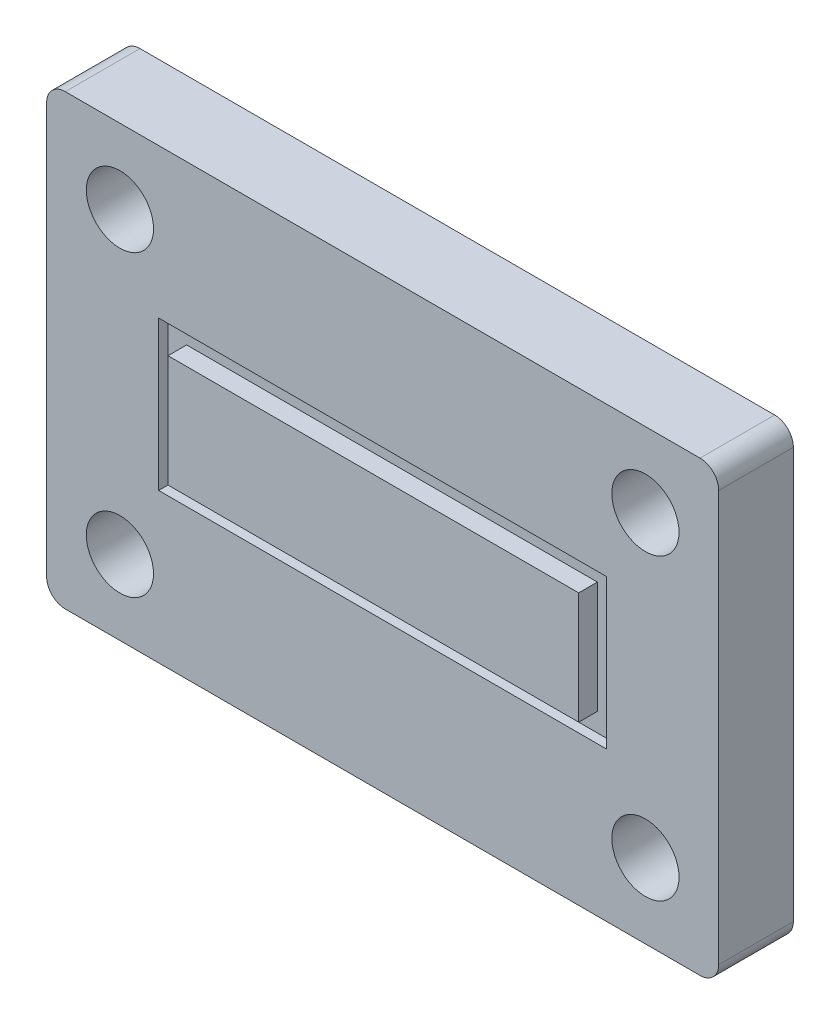
ISO-10303-21;
HEADER;
FILE_DESCRIPTION(('STEP AP214'),'2;1');
FILE_NAME('part.step','',(''),(''),'','','');
FILE_SCHEMA(('AUTOMOTIVE_DESIGN { 1 0 10303 214 1 1 1 1 }'));
ENDSEC;
DATA;
#1=APPLICATION_CONTEXT('core data for automotive mechanical design processes');
#2=APPLICATION_PROTOCOL_DEFINITION('international standard','automotive_design',2000,#1);
#3=PRODUCT_CONTEXT('',#1,'mechanical');
#4=PRODUCT('Part','Part','',(#3));
#5=PRODUCT_RELATED_PRODUCT_CATEGORY('part','',(#4));
#6=PRODUCT_DEFINITION_FORMATION('','',#4);
#7=PRODUCT_DEFINITION_CONTEXT('part definition',#1,'design');
#8=PRODUCT_DEFINITION('design','',#6,#7);
#9=PRODUCT_DEFINITION_SHAPE('','',#8);
#10=(LENGTH_UNIT() NAMED_UNIT(*) SI_UNIT(.MILLI.,.METRE.));
#11=(NAMED_UNIT(*) PLANE_ANGLE_UNIT() SI_UNIT($,.RADIAN.));
#12=(NAMED_UNIT(*) SI_UNIT($,.STERADIAN.) SOLID_ANGLE_UNIT());
#13=UNCERTAINTY_MEASURE_WITH_UNIT(LENGTH_MEASURE(1.E-05),#10,'distance_accuracy_value','');
#14=(GEOMETRIC_REPRESENTATION_CONTEXT(3) GLOBAL_UNCERTAINTY_ASSIGNED_CONTEXT((#13)) GLOBAL_UNIT_ASSIGNED_CONTEXT((#10,
#11,#12)) REPRESENTATION_CONTEXT('',''));
#15=CARTESIAN_POINT('',(0.,0.,0.));
#16=DIRECTION('',(0.,0.,1.));
#17=DIRECTION('',(1.,0.,0.));
#18=AXIS2_PLACEMENT_3D('',#15,#16,#17);
#19=CARTESIAN_POINT('',(29.,15.,4.5));
#20=DIRECTION('',(0.,-1.,0.));
#21=DIRECTION('',(0.,0.,-1.));
#22=AXIS2_PLACEMENT_3D('',#19,#20,#21);
#23=PLANE('',#22);
#24=DIRECTION('',(-1.,0.,0.));
#25=VECTOR('',#24,1.);
#26=CARTESIAN_POINT('',(29.,15.,3.5));
#27=LINE('',#26,#25);
#28=CARTESIAN_POINT('',(29.,15.,3.5));
#29=VERTEX_POINT('',#28);
#30=CARTESIAN_POINT('',(7.,15.,3.5));
#31=VERTEX_POINT('',#30);
#32=EDGE_CURVE('E106',#29,#31,#27,.T.);
#33=ORIENTED_EDGE('',*,*,#32,.T.);
#34=DIRECTION('',(0.,0.,-1.));
#35=VECTOR('',#34,1.);
#36=CARTESIAN_POINT('',(7.,15.,4.5));
#37=LINE('',#36,#35);
#38=CARTESIAN_POINT('',(7.,15.,4.5));
#39=VERTEX_POINT('',#38);
#40=EDGE_CURVE('E12',#39,#31,#37,.T.);
#41=ORIENTED_EDGE('',*,*,#40,.F.);
#42=DIRECTION('',(-1.,0.,0.));
#43=VECTOR('',#42,1.);
#44=CARTESIAN_POINT('',(29.,15.,4.5));
#45=LINE('',#44,#43);
#46=CARTESIAN_POINT('',(29.,15.,4.5));
#47=VERTEX_POINT('',#46);
#48=EDGE_CURVE('E94',#47,#39,#45,.T.);
#49=ORIENTED_EDGE('',*,*,#48,.F.);
#50=DIRECTION('',(0.,0.,-1.));
#51=VECTOR('',#50,1.);
#52=CARTESIAN_POINT('',(29.,15.,4.5));
#53=LINE('',#52,#51);
#54=EDGE_CURVE('E102',#47,#29,#53,.T.);
#55=ORIENTED_EDGE('',*,*,#54,.T.);
#56=EDGE_LOOP('',(#33,#41,#49,#55));
#57=FACE_BOUND('',#56,.T.);
#58=ADVANCED_FACE('F43',(#57),#23,.F.);
#59=CARTESIAN_POINT('',(7.,15.,4.5));
#60=DIRECTION('',(1.,0.,0.));
#61=DIRECTION('',(0.,0.,-1.));
#62=AXIS2_PLACEMENT_3D('',#59,#60,#61);
#63=PLANE('',#62);
#64=DIRECTION('',(0.,-1.,0.));
#65=VECTOR('',#64,1.);
#66=CARTESIAN_POINT('',(7.,15.,3.5));
#67=LINE('',#66,#65);
#68=CARTESIAN_POINT('',(7.,9.,3.5));
#69=VERTEX_POINT('',#68);
#70=EDGE_CURVE('E98',#31,#69,#67,.T.);
#71=ORIENTED_EDGE('',*,*,#70,.T.);
#72=DIRECTION('',(0.,0.,-1.));
#73=VECTOR('',#72,1.);
#74=CARTESIAN_POINT('',(7.,9.,4.5));
#75=LINE('',#74,#73);
#76=CARTESIAN_POINT('',(7.,9.,4.5));
#77=VERTEX_POINT('',#76);
#78=EDGE_CURVE('E51',#77,#69,#75,.T.);
#79=ORIENTED_EDGE('',*,*,#78,.F.);
#80=DIRECTION('',(0.,-1.,0.));
#81=VECTOR('',#80,1.);
#82=CARTESIAN_POINT('',(7.,15.,4.5));
#83=LINE('',#82,#81);
#84=EDGE_CURVE('E89',#39,#77,#83,.T.);
#85=ORIENTED_EDGE('',*,*,#84,.F.);
#86=ORIENTED_EDGE('',*,*,#40,.T.);
#87=EDGE_LOOP('',(#71,#79,#85,#86));
#88=FACE_BOUND('',#87,.T.);
#89=ADVANCED_FACE('F97',(#88),#63,.F.);
#90=CARTESIAN_POINT('',(7.,9.,4.5));
#91=DIRECTION('',(0.,1.,0.));
#92=DIRECTION('',(0.,0.,1.));
#93=AXIS2_PLACEMENT_3D('',#90,#91,#92);
#94=PLANE('',#93);
#95=DIRECTION('',(1.,0.,0.));
#96=VECTOR('',#95,1.);
#97=CARTESIAN_POINT('',(7.,9.,3.5));
#98=LINE('',#97,#96);
#99=CARTESIAN_POINT('',(29.,9.,3.5));
#100=VERTEX_POINT('',#99);
#101=EDGE_CURVE('E76',#69,#100,#98,.T.);
#102=ORIENTED_EDGE('',*,*,#101,.T.);
#103=DIRECTION('',(0.,0.,-1.));
#104=VECTOR('',#103,1.);
#105=CARTESIAN_POINT('',(29.,9.,4.5));
#106=LINE('',#105,#104);
#107=CARTESIAN_POINT('',(29.,9.,4.5));
#108=VERTEX_POINT('',#107);
#109=EDGE_CURVE('E99',#108,#100,#106,.T.);
#110=ORIENTED_EDGE('',*,*,#109,.F.);
#111=DIRECTION('',(1.,0.,0.));
#112=VECTOR('',#111,1.);
#113=CARTESIAN_POINT('',(7.,9.,4.5));
#114=LINE('',#113,#112);
#115=EDGE_CURVE('E92',#77,#108,#114,.T.);
#116=ORIENTED_EDGE('',*,*,#115,.F.);
#117=ORIENTED_EDGE('',*,*,#78,.T.);
#118=EDGE_LOOP('',(#102,#110,#116,#117));
#119=FACE_BOUND('',#118,.T.);
#120=ADVANCED_FACE('F100',(#119),#94,.F.);
#121=CARTESIAN_POINT('',(29.,9.,4.5));
#122=DIRECTION('',(-1.,0.,0.));
#123=DIRECTION('',(0.,0.,1.));
#124=AXIS2_PLACEMENT_3D('',#121,#122,#123);
#125=PLANE('',#124);
#126=DIRECTION('',(0.,1.,0.));
#127=VECTOR('',#126,1.);
#128=CARTESIAN_POINT('',(29.,9.,3.5));
#129=LINE('',#128,#127);
#130=EDGE_CURVE('E82',#100,#29,#129,.T.);
#131=ORIENTED_EDGE('',*,*,#130,.T.);
#132=ORIENTED_EDGE('',*,*,#54,.F.);
#133=DIRECTION('',(0.,1.,0.));
#134=VECTOR('',#133,1.);
#135=CARTESIAN_POINT('',(29.,9.,4.5));
#136=LINE('',#135,#134);
#137=EDGE_CURVE('E59',#108,#47,#136,.T.);
#138=ORIENTED_EDGE('',*,*,#137,.F.);
#139=ORIENTED_EDGE('',*,*,#109,.T.);
#140=EDGE_LOOP('',(#131,#132,#138,#139));
#141=FACE_BOUND('',#140,.T.);
#142=ADVANCED_FACE('F113',(#141),#125,.F.);
#143=CARTESIAN_POINT('',(0.,0.,4.5));
#144=DIRECTION('',(0.,0.,1.));
#145=DIRECTION('',(1.,0.,0.));
#146=AXIS2_PLACEMENT_3D('',#143,#144,#145);
#147=PLANE('',#146);
#148=ORIENTED_EDGE('',*,*,#48,.T.);
#149=ORIENTED_EDGE('',*,*,#84,.T.);
#150=ORIENTED_EDGE('',*,*,#115,.T.);
#151=ORIENTED_EDGE('',*,*,#137,.T.);
#152=EDGE_LOOP('',(#148,#149,#150,#151));
#153=FACE_BOUND('',#152,.T.);
#154=ADVANCED_FACE('F90',(#153),#147,.T.);
#155=CARTESIAN_POINT('',(0.,0.,3.5));
#156=DIRECTION('',(0.,0.,1.));
#157=DIRECTION('',(1.,0.,0.));
#158=AXIS2_PLACEMENT_3D('',#155,#156,#157);
#159=PLANE('',#158);
#160=ORIENTED_EDGE('',*,*,#32,.F.);
#161=ORIENTED_EDGE('',*,*,#130,.F.);
#162=ORIENTED_EDGE('',*,*,#101,.F.);
#163=ORIENTED_EDGE('',*,*,#70,.F.);
#164=EDGE_LOOP('',(#160,#161,#162,#163));
#165=FACE_BOUND('',#164,.T.);
#166=ADVANCED_FACE('F116',(#165),#159,.F.);
#167=CLOSED_SHELL('',(#58,#89,#120,#142,#154,#166));
#168=MANIFOLD_SOLID_BREP('B2',#167);
#169=CARTESIAN_POINT('',(0.,0.,4.));
#170=DIRECTION('',(1.,0.,0.));
#171=DIRECTION('',(0.,0.,-1.));
#172=AXIS2_PLACEMENT_3D('',#169,#170,#171);
#173=PLANE('',#172);
#174=DIRECTION('',(0.,-1.,0.));
#175=VECTOR('',#174,1.);
#176=CARTESIAN_POINT('',(0.,0.,0.));
#177=LINE('',#176,#175);
#178=CARTESIAN_POINT('',(0.,23.,0.));
#179=VERTEX_POINT('',#178);
#180=CARTESIAN_POINT('',(0.,1.,0.));
#181=VERTEX_POINT('',#180);
#182=EDGE_CURVE('E314',#179,#181,#177,.T.);
#183=ORIENTED_EDGE('',*,*,#182,.T.);
#184=DIRECTION('',(0.,0.,-1.));
#185=VECTOR('',#184,1.);
#186=CARTESIAN_POINT('',(0.,1.,4.));
#187=LINE('',#186,#185);
#188=CARTESIAN_POINT('',(0.,1.,4.));
#189=VERTEX_POINT('',#188);
#190=EDGE_CURVE('E41',#181,#189,#187,.F.);
#191=ORIENTED_EDGE('',*,*,#190,.T.);
#192=DIRECTION('',(0.,-1.,0.));
#193=VECTOR('',#192,1.);
#194=CARTESIAN_POINT('',(0.,0.,4.));
#195=LINE('',#194,#193);
#196=CARTESIAN_POINT('',(0.,23.,4.));
#197=VERTEX_POINT('',#196);
#198=EDGE_CURVE('E315',#197,#189,#195,.T.);
#199=ORIENTED_EDGE('',*,*,#198,.F.);
#200=DIRECTION('',(0.,0.,-1.));
#201=VECTOR('',#200,1.);
#202=CARTESIAN_POINT('',(0.,23.,4.));
#203=LINE('',#202,#201);
#204=EDGE_CURVE('E174',#197,#179,#203,.T.);
#205=ORIENTED_EDGE('',*,*,#204,.T.);
#206=EDGE_LOOP('',(#183,#191,#199,#205));
#207=FACE_BOUND('',#206,.T.);
#208=ADVANCED_FACE('F166',(#207),#173,.F.);
#209=CARTESIAN_POINT('',(0.,0.,4.));
#210=DIRECTION('',(0.,1.,0.));
#211=DIRECTION('',(0.,0.,1.));
#212=AXIS2_PLACEMENT_3D('',#209,#210,#211);
#213=PLANE('',#212);
#214=DIRECTION('',(1.,0.,0.));
#215=VECTOR('',#214,1.);
#216=CARTESIAN_POINT('',(0.,0.,0.));
#217=LINE('',#216,#215);
#218=CARTESIAN_POINT('',(1.,0.,0.));
#219=VERTEX_POINT('',#218);
#220=CARTESIAN_POINT('',(35.,0.,0.));
#221=VERTEX_POINT('',#220);
#222=EDGE_CURVE('E330',#219,#221,#217,.T.);
#223=ORIENTED_EDGE('',*,*,#222,.T.);
#224=DIRECTION('',(0.,0.,-1.));
#225=VECTOR('',#224,1.);
#226=CARTESIAN_POINT('',(35.,0.,4.));
#227=LINE('',#226,#225);
#228=CARTESIAN_POINT('',(35.,0.,4.));
#229=VERTEX_POINT('',#228);
#230=EDGE_CURVE('E189',#221,#229,#227,.F.);
#231=ORIENTED_EDGE('',*,*,#230,.T.);
#232=DIRECTION('',(1.,0.,0.));
#233=VECTOR('',#232,1.);
#234=CARTESIAN_POINT('',(0.,0.,4.));
#235=LINE('',#234,#233);
#236=CARTESIAN_POINT('',(1.,0.,4.));
#237=VERTEX_POINT('',#236);
#238=EDGE_CURVE('E318',#237,#229,#235,.T.);
#239=ORIENTED_EDGE('',*,*,#238,.F.);
#240=DIRECTION('',(0.,0.,-1.));
#241=VECTOR('',#240,1.);
#242=CARTESIAN_POINT('',(1.,0.,4.));
#243=LINE('',#242,#241);
#244=EDGE_CURVE('E366',#237,#219,#243,.T.);
#245=ORIENTED_EDGE('',*,*,#244,.T.);
#246=EDGE_LOOP('',(#223,#231,#239,#245));
#247=FACE_BOUND('',#246,.T.);
#248=ADVANCED_FACE('F385',(#247),#213,.F.);
#249=CARTESIAN_POINT('',(36.,0.,4.));
#250=DIRECTION('',(-1.,0.,0.));
#251=DIRECTION('',(0.,0.,1.));
#252=AXIS2_PLACEMENT_3D('',#249,#250,#251);
#253=PLANE('',#252);
#254=DIRECTION('',(0.,1.,0.));
#255=VECTOR('',#254,1.);
#256=CARTESIAN_POINT('',(36.,0.,0.));
#257=LINE('',#256,#255);
#258=CARTESIAN_POINT('',(36.,1.,0.));
#259=VERTEX_POINT('',#258);
#260=CARTESIAN_POINT('',(36.,23.,0.));
#261=VERTEX_POINT('',#260);
#262=EDGE_CURVE('E332',#259,#261,#257,.T.);
#263=ORIENTED_EDGE('',*,*,#262,.T.);
#264=DIRECTION('',(0.,0.,-1.));
#265=VECTOR('',#264,1.);
#266=CARTESIAN_POINT('',(36.,23.,4.));
#267=LINE('',#266,#265);
#268=CARTESIAN_POINT('',(36.,23.,4.));
#269=VERTEX_POINT('',#268);
#270=EDGE_CURVE('E356',#261,#269,#267,.F.);
#271=ORIENTED_EDGE('',*,*,#270,.T.);
#272=DIRECTION('',(0.,1.,0.));
#273=VECTOR('',#272,1.);
#274=CARTESIAN_POINT('',(36.,0.,4.));
#275=LINE('',#274,#273);
#276=CARTESIAN_POINT('',(36.,1.,4.));
#277=VERTEX_POINT('',#276);
#278=EDGE_CURVE('E321',#277,#269,#275,.T.);
#279=ORIENTED_EDGE('',*,*,#278,.F.);
#280=DIRECTION('',(0.,0.,-1.));
#281=VECTOR('',#280,1.);
#282=CARTESIAN_POINT('',(36.,1.,4.));
#283=LINE('',#282,#281);
#284=EDGE_CURVE('E353',#277,#259,#283,.T.);
#285=ORIENTED_EDGE('',*,*,#284,.T.);
#286=EDGE_LOOP('',(#263,#271,#279,#285));
#287=FACE_BOUND('',#286,.T.);
#288=ADVANCED_FACE('F395',(#287),#253,.F.);
#289=CARTESIAN_POINT('',(0.,24.,4.));
#290=DIRECTION('',(0.,-1.,0.));
#291=DIRECTION('',(0.,0.,-1.));
#292=AXIS2_PLACEMENT_3D('',#289,#290,#291);
#293=PLANE('',#292);
#294=DIRECTION('',(-1.,0.,0.));
#295=VECTOR('',#294,1.);
#296=CARTESIAN_POINT('',(0.,24.,4.));
#297=LINE('',#296,#295);
#298=CARTESIAN_POINT('',(35.,24.,4.));
#299=VERTEX_POINT('',#298);
#300=CARTESIAN_POINT('',(1.,24.,4.));
#301=VERTEX_POINT('',#300);
#302=EDGE_CURVE('E324',#299,#301,#297,.T.);
#303=ORIENTED_EDGE('',*,*,#302,.F.);
#304=DIRECTION('',(0.,0.,-1.));
#305=VECTOR('',#304,1.);
#306=CARTESIAN_POINT('',(35.,24.,4.));
#307=LINE('',#306,#305);
#308=CARTESIAN_POINT('',(35.,24.,0.));
#309=VERTEX_POINT('',#308);
#310=EDGE_CURVE('E342',#299,#309,#307,.T.);
#311=ORIENTED_EDGE('',*,*,#310,.T.);
#312=DIRECTION('',(-1.,0.,0.));
#313=VECTOR('',#312,1.);
#314=CARTESIAN_POINT('',(0.,24.,0.));
#315=LINE('',#314,#313);
#316=CARTESIAN_POINT('',(1.,24.,0.));
#317=VERTEX_POINT('',#316);
#318=EDGE_CURVE('E319',#309,#317,#315,.T.);
#319=ORIENTED_EDGE('',*,*,#318,.T.);
#320=DIRECTION('',(0.,0.,-1.));
#321=VECTOR('',#320,1.);
#322=CARTESIAN_POINT('',(1.,24.,4.));
#323=LINE('',#322,#321);
#324=EDGE_CURVE('E327',#317,#301,#323,.F.);
#325=ORIENTED_EDGE('',*,*,#324,.T.);
#326=EDGE_LOOP('',(#303,#311,#319,#325));
#327=FACE_BOUND('',#326,.T.);
#328=ADVANCED_FACE('F403',(#327),#293,.F.);
#329=CARTESIAN_POINT('',(0.,0.,4.));
#330=DIRECTION('',(0.,0.,-1.));
#331=DIRECTION('',(-1.,0.,0.));
#332=AXIS2_PLACEMENT_3D('',#329,#330,#331);
#333=PLANE('',#332);
#334=DIRECTION('',(1.,0.,0.));
#335=VECTOR('',#334,1.);
#336=CARTESIAN_POINT('',(6.,8.,4.));
#337=LINE('',#336,#335);
#338=CARTESIAN_POINT('',(6.,8.,4.));
#339=VERTEX_POINT('',#338);
#340=CARTESIAN_POINT('',(30.,8.,4.));
#341=VERTEX_POINT('',#340);
#342=EDGE_CURVE('E285',#339,#341,#337,.T.);
#343=ORIENTED_EDGE('',*,*,#342,.F.);
#344=DIRECTION('',(0.,-1.,0.));
#345=VECTOR('',#344,1.);
#346=CARTESIAN_POINT('',(6.,16.,4.));
#347=LINE('',#346,#345);
#348=CARTESIAN_POINT('',(6.,16.,4.));
#349=VERTEX_POINT('',#348);
#350=EDGE_CURVE('E181',#349,#339,#347,.T.);
#351=ORIENTED_EDGE('',*,*,#350,.F.);
#352=DIRECTION('',(-1.,0.,0.));
#353=VECTOR('',#352,1.);
#354=CARTESIAN_POINT('',(6.,16.,4.));
#355=LINE('',#354,#353);
#356=CARTESIAN_POINT('',(30.,16.,4.));
#357=VERTEX_POINT('',#356);
#358=EDGE_CURVE('E276',#357,#349,#355,.T.);
#359=ORIENTED_EDGE('',*,*,#358,.F.);
#360=DIRECTION('',(0.,1.,0.));
#361=VECTOR('',#360,1.);
#362=CARTESIAN_POINT('',(30.,16.,4.));
#363=LINE('',#362,#361);
#364=EDGE_CURVE('E279',#341,#357,#363,.T.);
#365=ORIENTED_EDGE('',*,*,#364,.F.);
#366=EDGE_LOOP('',(#343,#351,#359,#365));
#367=FACE_BOUND('',#366,.T.);
#368=CARTESIAN_POINT('',(3.92499999999992,20.,4.));
#369=DIRECTION('',(0.,0.,1.));
#370=DIRECTION('',(1.,0.,0.));
#371=AXIS2_PLACEMENT_3D('',#368,#369,#370);
#372=CIRCLE('',#371,1.8);
#373=CARTESIAN_POINT('',(5.72499999999992,20.,4.));
#374=VERTEX_POINT('',#373);
#375=EDGE_CURVE('E291',#374,#374,#372,.T.);
#376=ORIENTED_EDGE('',*,*,#375,.F.);
#377=EDGE_LOOP('',(#376));
#378=FACE_BOUND('',#377,.T.);
#379=CARTESIAN_POINT('',(32.0749999999999,20.,4.));
#380=DIRECTION('',(0.,0.,1.));
#381=DIRECTION('',(1.,0.,0.));
#382=AXIS2_PLACEMENT_3D('',#379,#380,#381);
#383=CIRCLE('',#382,1.8);
#384=CARTESIAN_POINT('',(33.8749999999999,20.,4.));
#385=VERTEX_POINT('',#384);
#386=EDGE_CURVE('E298',#385,#385,#383,.T.);
#387=ORIENTED_EDGE('',*,*,#386,.F.);
#388=EDGE_LOOP('',(#387));
#389=FACE_BOUND('',#388,.T.);
#390=CARTESIAN_POINT('',(32.0750000000001,4.,4.));
#391=DIRECTION('',(0.,0.,1.));
#392=DIRECTION('',(1.,0.,0.));
#393=AXIS2_PLACEMENT_3D('',#390,#391,#392);
#394=CIRCLE('',#393,1.8);
#395=CARTESIAN_POINT('',(33.8750000000001,4.,4.));
#396=VERTEX_POINT('',#395);
#397=EDGE_CURVE('E302',#396,#396,#394,.T.);
#398=ORIENTED_EDGE('',*,*,#397,.F.);
#399=EDGE_LOOP('',(#398));
#400=FACE_BOUND('',#399,.T.);
#401=CARTESIAN_POINT('',(3.92500000000008,4.,4.));
#402=DIRECTION('',(0.,0.,1.));
#403=DIRECTION('',(1.,0.,0.));
#404=AXIS2_PLACEMENT_3D('',#401,#402,#403);
#405=CIRCLE('',#404,1.8);
#406=CARTESIAN_POINT('',(5.72500000000008,4.,4.));
#407=VERTEX_POINT('',#406);
#408=EDGE_CURVE('E308',#407,#407,#405,.T.);
#409=ORIENTED_EDGE('',*,*,#408,.F.);
#410=EDGE_LOOP('',(#409));
#411=FACE_BOUND('',#410,.T.);
#412=ORIENTED_EDGE('',*,*,#278,.T.);
#413=CARTESIAN_POINT('',(35.,23.,4.));
#414=DIRECTION('',(0.,0.,-1.));
#415=DIRECTION('',(-1.,0.,0.));
#416=AXIS2_PLACEMENT_3D('',#413,#414,#415);
#417=CIRCLE('',#416,1.);
#418=EDGE_CURVE('E364',#269,#299,#417,.F.);
#419=ORIENTED_EDGE('',*,*,#418,.T.);
#420=ORIENTED_EDGE('',*,*,#302,.T.);
#421=CARTESIAN_POINT('',(1.,23.,4.));
#422=DIRECTION('',(0.,0.,-1.));
#423=DIRECTION('',(-1.,0.,0.));
#424=AXIS2_PLACEMENT_3D('',#421,#422,#423);
#425=CIRCLE('',#424,1.);
#426=EDGE_CURVE('E358',#301,#197,#425,.F.);
#427=ORIENTED_EDGE('',*,*,#426,.T.);
#428=ORIENTED_EDGE('',*,*,#198,.T.);
#429=CARTESIAN_POINT('',(1.,1.,4.));
#430=DIRECTION('',(0.,0.,-1.));
#431=DIRECTION('',(-1.,0.,0.));
#432=AXIS2_PLACEMENT_3D('',#429,#430,#431);
#433=CIRCLE('',#432,1.);
#434=EDGE_CURVE('E360',#189,#237,#433,.F.);
#435=ORIENTED_EDGE('',*,*,#434,.T.);
#436=ORIENTED_EDGE('',*,*,#238,.T.);
#437=CARTESIAN_POINT('',(35.,1.,4.));
#438=DIRECTION('',(0.,0.,-1.));
#439=DIRECTION('',(-1.,0.,0.));
#440=AXIS2_PLACEMENT_3D('',#437,#438,#439);
#441=CIRCLE('',#440,1.);
#442=EDGE_CURVE('E362',#229,#277,#441,.F.);
#443=ORIENTED_EDGE('',*,*,#442,.T.);
#444=EDGE_LOOP('',(#412,#419,#420,#427,#428,#435,#436,#443));
#445=FACE_BOUND('',#444,.T.);
#446=ADVANCED_FACE('F388',(#367,#378,#389,#400,#411,#445),#333,.F.);
#447=CARTESIAN_POINT('',(0.,0.,0.));
#448=DIRECTION('',(0.,0.,-1.));
#449=DIRECTION('',(-1.,0.,0.));
#450=AXIS2_PLACEMENT_3D('',#447,#448,#449);
#451=PLANE('',#450);
#452=CARTESIAN_POINT('',(3.92499999999992,20.,0.));
#453=DIRECTION('',(0.,0.,-1.));
#454=DIRECTION('',(-1.,0.,0.));
#455=AXIS2_PLACEMENT_3D('',#452,#453,#454);
#456=CIRCLE('',#455,1.8);
#457=CARTESIAN_POINT('',(2.12499999999992,20.,0.));
#458=VERTEX_POINT('',#457);
#459=EDGE_CURVE('E297',#458,#458,#456,.T.);
#460=ORIENTED_EDGE('',*,*,#459,.F.);
#461=EDGE_LOOP('',(#460));
#462=FACE_BOUND('',#461,.T.);
#463=CARTESIAN_POINT('',(32.0749999999999,20.,0.));
#464=DIRECTION('',(0.,0.,-1.));
#465=DIRECTION('',(-1.,0.,0.));
#466=AXIS2_PLACEMENT_3D('',#463,#464,#465);
#467=CIRCLE('',#466,1.8);
#468=CARTESIAN_POINT('',(30.2749999999999,20.,0.));
#469=VERTEX_POINT('',#468);
#470=EDGE_CURVE('E301',#469,#469,#467,.T.);
#471=ORIENTED_EDGE('',*,*,#470,.F.);
#472=EDGE_LOOP('',(#471));
#473=FACE_BOUND('',#472,.T.);
#474=CARTESIAN_POINT('',(32.0750000000001,4.,0.));
#475=DIRECTION('',(0.,0.,-1.));
#476=DIRECTION('',(-1.,0.,0.));
#477=AXIS2_PLACEMENT_3D('',#474,#475,#476);
#478=CIRCLE('',#477,1.8);
#479=CARTESIAN_POINT('',(30.2750000000001,4.,0.));
#480=VERTEX_POINT('',#479);
#481=EDGE_CURVE('E305',#480,#480,#478,.T.);
#482=ORIENTED_EDGE('',*,*,#481,.F.);
#483=EDGE_LOOP('',(#482));
#484=FACE_BOUND('',#483,.T.);
#485=CARTESIAN_POINT('',(3.92500000000008,4.,0.));
#486=DIRECTION('',(0.,0.,-1.));
#487=DIRECTION('',(-1.,0.,0.));
#488=AXIS2_PLACEMENT_3D('',#485,#486,#487);
#489=CIRCLE('',#488,1.8);
#490=CARTESIAN_POINT('',(2.12500000000009,4.,0.));
#491=VERTEX_POINT('',#490);
#492=EDGE_CURVE('E311',#491,#491,#489,.T.);
#493=ORIENTED_EDGE('',*,*,#492,.F.);
#494=EDGE_LOOP('',(#493));
#495=FACE_BOUND('',#494,.T.);
#496=ORIENTED_EDGE('',*,*,#318,.F.);
#497=CARTESIAN_POINT('',(35.,23.,0.));
#498=DIRECTION('',(0.,0.,-1.));
#499=DIRECTION('',(-1.,0.,0.));
#500=AXIS2_PLACEMENT_3D('',#497,#498,#499);
#501=CIRCLE('',#500,1.);
#502=EDGE_CURVE('E351',#309,#261,#501,.T.);
#503=ORIENTED_EDGE('',*,*,#502,.T.);
#504=ORIENTED_EDGE('',*,*,#262,.F.);
#505=CARTESIAN_POINT('',(35.,1.,0.));
#506=DIRECTION('',(0.,0.,-1.));
#507=DIRECTION('',(-1.,0.,0.));
#508=AXIS2_PLACEMENT_3D('',#505,#506,#507);
#509=CIRCLE('',#508,1.);
#510=EDGE_CURVE('E349',#259,#221,#509,.T.);
#511=ORIENTED_EDGE('',*,*,#510,.T.);
#512=ORIENTED_EDGE('',*,*,#222,.F.);
#513=CARTESIAN_POINT('',(1.,1.,0.));
#514=DIRECTION('',(0.,0.,-1.));
#515=DIRECTION('',(-1.,0.,0.));
#516=AXIS2_PLACEMENT_3D('',#513,#514,#515);
#517=CIRCLE('',#516,1.);
#518=EDGE_CURVE('E347',#219,#181,#517,.T.);
#519=ORIENTED_EDGE('',*,*,#518,.T.);
#520=ORIENTED_EDGE('',*,*,#182,.F.);
#521=CARTESIAN_POINT('',(1.,23.,0.));
#522=DIRECTION('',(0.,0.,-1.));
#523=DIRECTION('',(-1.,0.,0.));
#524=AXIS2_PLACEMENT_3D('',#521,#522,#523);
#525=CIRCLE('',#524,1.);
#526=EDGE_CURVE('E345',#179,#317,#525,.T.);
#527=ORIENTED_EDGE('',*,*,#526,.T.);
#528=EDGE_LOOP('',(#496,#503,#504,#511,#512,#519,#520,#527));
#529=FACE_BOUND('',#528,.T.);
#530=ADVANCED_FACE('F379',(#462,#473,#484,#495,#529),#451,.T.);
#531=CARTESIAN_POINT('',(3.92500000000008,4.,4.));
#532=DIRECTION('',(0.,0.,1.));
#533=DIRECTION('',(1.,0.,0.));
#534=AXIS2_PLACEMENT_3D('',#531,#532,#533);
#535=CYLINDRICAL_SURFACE('',#534,1.8);
#536=ORIENTED_EDGE('',*,*,#492,.T.);
#537=EDGE_LOOP('',(#536));
#538=FACE_BOUND('',#537,.T.);
#539=ORIENTED_EDGE('',*,*,#408,.T.);
#540=EDGE_LOOP('',(#539));
#541=FACE_BOUND('',#540,.T.);
#542=ADVANCED_FACE('F501',(#538,#541),#535,.F.);
#543=CARTESIAN_POINT('',(32.0750000000001,4.,4.));
#544=DIRECTION('',(0.,0.,1.));
#545=DIRECTION('',(1.,0.,0.));
#546=AXIS2_PLACEMENT_3D('',#543,#544,#545);
#547=CYLINDRICAL_SURFACE('',#546,1.8);
#548=ORIENTED_EDGE('',*,*,#481,.T.);
#549=EDGE_LOOP('',(#548));
#550=FACE_BOUND('',#549,.T.);
#551=ORIENTED_EDGE('',*,*,#397,.T.);
#552=EDGE_LOOP('',(#551));
#553=FACE_BOUND('',#552,.T.);
#554=ADVANCED_FACE('F497',(#550,#553),#547,.F.);
#555=CARTESIAN_POINT('',(32.0749999999999,20.,4.));
#556=DIRECTION('',(0.,0.,1.));
#557=DIRECTION('',(1.,0.,0.));
#558=AXIS2_PLACEMENT_3D('',#555,#556,#557);
#559=CYLINDRICAL_SURFACE('',#558,1.8);
#560=ORIENTED_EDGE('',*,*,#470,.T.);
#561=EDGE_LOOP('',(#560));
#562=FACE_BOUND('',#561,.T.);
#563=ORIENTED_EDGE('',*,*,#386,.T.);
#564=EDGE_LOOP('',(#563));
#565=FACE_BOUND('',#564,.T.);
#566=ADVANCED_FACE('F493',(#562,#565),#559,.F.);
#567=CARTESIAN_POINT('',(3.92499999999992,20.,4.));
#568=DIRECTION('',(0.,0.,1.));
#569=DIRECTION('',(1.,0.,0.));
#570=AXIS2_PLACEMENT_3D('',#567,#568,#569);
#571=CYLINDRICAL_SURFACE('',#570,1.8);
#572=ORIENTED_EDGE('',*,*,#459,.T.);
#573=EDGE_LOOP('',(#572));
#574=FACE_BOUND('',#573,.T.);
#575=ORIENTED_EDGE('',*,*,#375,.T.);
#576=EDGE_LOOP('',(#575));
#577=FACE_BOUND('',#576,.T.);
#578=ADVANCED_FACE('F422',(#574,#577),#571,.F.);
#579=CARTESIAN_POINT('',(35.,23.,4.));
#580=DIRECTION('',(0.,0.,-1.));
#581=DIRECTION('',(-1.,0.,0.));
#582=AXIS2_PLACEMENT_3D('',#579,#580,#581);
#583=CYLINDRICAL_SURFACE('',#582,1.);
#584=ORIENTED_EDGE('',*,*,#418,.F.);
#585=ORIENTED_EDGE('',*,*,#270,.F.);
#586=ORIENTED_EDGE('',*,*,#502,.F.);
#587=ORIENTED_EDGE('',*,*,#310,.F.);
#588=EDGE_LOOP('',(#584,#585,#586,#587));
#589=FACE_BOUND('',#588,.T.);
#590=ADVANCED_FACE('F400',(#589),#583,.T.);
#591=CARTESIAN_POINT('',(35.,1.,4.));
#592=DIRECTION('',(0.,0.,-1.));
#593=DIRECTION('',(-1.,0.,0.));
#594=AXIS2_PLACEMENT_3D('',#591,#592,#593);
#595=CYLINDRICAL_SURFACE('',#594,1.);
#596=ORIENTED_EDGE('',*,*,#442,.F.);
#597=ORIENTED_EDGE('',*,*,#230,.F.);
#598=ORIENTED_EDGE('',*,*,#510,.F.);
#599=ORIENTED_EDGE('',*,*,#284,.F.);
#600=EDGE_LOOP('',(#596,#597,#598,#599));
#601=FACE_BOUND('',#600,.T.);
#602=ADVANCED_FACE('F392',(#601),#595,.T.);
#603=CARTESIAN_POINT('',(1.,1.,4.));
#604=DIRECTION('',(0.,0.,-1.));
#605=DIRECTION('',(-1.,0.,0.));
#606=AXIS2_PLACEMENT_3D('',#603,#604,#605);
#607=CYLINDRICAL_SURFACE('',#606,1.);
#608=ORIENTED_EDGE('',*,*,#434,.F.);
#609=ORIENTED_EDGE('',*,*,#190,.F.);
#610=ORIENTED_EDGE('',*,*,#518,.F.);
#611=ORIENTED_EDGE('',*,*,#244,.F.);
#612=EDGE_LOOP('',(#608,#609,#610,#611));
#613=FACE_BOUND('',#612,.T.);
#614=ADVANCED_FACE('F384',(#613),#607,.T.);
#615=CARTESIAN_POINT('',(1.,23.,4.));
#616=DIRECTION('',(0.,0.,-1.));
#617=DIRECTION('',(-1.,0.,0.));
#618=AXIS2_PLACEMENT_3D('',#615,#616,#617);
#619=CYLINDRICAL_SURFACE('',#618,1.);
#620=ORIENTED_EDGE('',*,*,#426,.F.);
#621=ORIENTED_EDGE('',*,*,#324,.F.);
#622=ORIENTED_EDGE('',*,*,#526,.F.);
#623=ORIENTED_EDGE('',*,*,#204,.F.);
#624=EDGE_LOOP('',(#620,#621,#622,#623));
#625=FACE_BOUND('',#624,.T.);
#626=ADVANCED_FACE('F168',(#625),#619,.T.);
#627=CARTESIAN_POINT('',(6.,16.,3.5));
#628=DIRECTION('',(-1.,0.,0.));
#629=DIRECTION('',(0.,0.,1.));
#630=AXIS2_PLACEMENT_3D('',#627,#628,#629);
#631=PLANE('',#630);
#632=ORIENTED_EDGE('',*,*,#350,.T.);
#633=DIRECTION('',(0.,0.,1.));
#634=VECTOR('',#633,1.);
#635=CARTESIAN_POINT('',(6.,8.,3.5));
#636=LINE('',#635,#634);
#637=CARTESIAN_POINT('',(6.,8.,3.5));
#638=VERTEX_POINT('',#637);
#639=EDGE_CURVE('E254',#638,#339,#636,.T.);
#640=ORIENTED_EDGE('',*,*,#639,.F.);
#641=DIRECTION('',(0.,-1.,0.));
#642=VECTOR('',#641,1.);
#643=CARTESIAN_POINT('',(6.,16.,3.5));
#644=LINE('',#643,#642);
#645=CARTESIAN_POINT('',(6.,16.,3.5));
#646=VERTEX_POINT('',#645);
#647=EDGE_CURVE('E258',#646,#638,#644,.T.);
#648=ORIENTED_EDGE('',*,*,#647,.F.);
#649=DIRECTION('',(0.,0.,1.));
#650=VECTOR('',#649,1.);
#651=CARTESIAN_POINT('',(6.,16.,3.5));
#652=LINE('',#651,#650);
#653=EDGE_CURVE('E289',#646,#349,#652,.T.);
#654=ORIENTED_EDGE('',*,*,#653,.T.);
#655=EDGE_LOOP('',(#632,#640,#648,#654));
#656=FACE_BOUND('',#655,.T.);
#657=ADVANCED_FACE('F256',(#656),#631,.F.);
#658=CARTESIAN_POINT('',(6.,16.,3.5));
#659=DIRECTION('',(0.,1.,0.));
#660=DIRECTION('',(0.,0.,1.));
#661=AXIS2_PLACEMENT_3D('',#658,#659,#660);
#662=PLANE('',#661);
#663=ORIENTED_EDGE('',*,*,#358,.T.);
#664=ORIENTED_EDGE('',*,*,#653,.F.);
#665=DIRECTION('',(-1.,0.,0.));
#666=VECTOR('',#665,1.);
#667=CARTESIAN_POINT('',(6.,16.,3.5));
#668=LINE('',#667,#666);
#669=CARTESIAN_POINT('',(30.,16.,3.5));
#670=VERTEX_POINT('',#669);
#671=EDGE_CURVE('E264',#670,#646,#668,.T.);
#672=ORIENTED_EDGE('',*,*,#671,.F.);
#673=DIRECTION('',(0.,0.,1.));
#674=VECTOR('',#673,1.);
#675=CARTESIAN_POINT('',(30.,16.,3.5));
#676=LINE('',#675,#674);
#677=EDGE_CURVE('E292',#670,#357,#676,.T.);
#678=ORIENTED_EDGE('',*,*,#677,.T.);
#679=EDGE_LOOP('',(#663,#664,#672,#678));
#680=FACE_BOUND('',#679,.T.);
#681=ADVANCED_FACE('F410',(#680),#662,.F.);
#682=CARTESIAN_POINT('',(30.,16.,3.5));
#683=DIRECTION('',(1.,0.,0.));
#684=DIRECTION('',(0.,0.,-1.));
#685=AXIS2_PLACEMENT_3D('',#682,#683,#684);
#686=PLANE('',#685);
#687=ORIENTED_EDGE('',*,*,#364,.T.);
#688=ORIENTED_EDGE('',*,*,#677,.F.);
#689=DIRECTION('',(0.,1.,0.));
#690=VECTOR('',#689,1.);
#691=CARTESIAN_POINT('',(30.,16.,3.5));
#692=LINE('',#691,#690);
#693=CARTESIAN_POINT('',(30.,8.,3.5));
#694=VERTEX_POINT('',#693);
#695=EDGE_CURVE('E272',#694,#670,#692,.T.);
#696=ORIENTED_EDGE('',*,*,#695,.F.);
#697=DIRECTION('',(0.,0.,1.));
#698=VECTOR('',#697,1.);
#699=CARTESIAN_POINT('',(30.,8.,3.5));
#700=LINE('',#699,#698);
#701=EDGE_CURVE('E263',#694,#341,#700,.T.);
#702=ORIENTED_EDGE('',*,*,#701,.T.);
#703=EDGE_LOOP('',(#687,#688,#696,#702));
#704=FACE_BOUND('',#703,.T.);
#705=ADVANCED_FACE('F461',(#704),#686,.F.);
#706=CARTESIAN_POINT('',(6.,8.,3.5));
#707=DIRECTION('',(0.,-1.,0.));
#708=DIRECTION('',(0.,0.,-1.));
#709=AXIS2_PLACEMENT_3D('',#706,#707,#708);
#710=PLANE('',#709);
#711=ORIENTED_EDGE('',*,*,#342,.T.);
#712=ORIENTED_EDGE('',*,*,#701,.F.);
#713=DIRECTION('',(1.,0.,0.));
#714=VECTOR('',#713,1.);
#715=CARTESIAN_POINT('',(6.,8.,3.5));
#716=LINE('',#715,#714);
#717=EDGE_CURVE('E267',#638,#694,#716,.T.);
#718=ORIENTED_EDGE('',*,*,#717,.F.);
#719=ORIENTED_EDGE('',*,*,#639,.T.);
#720=EDGE_LOOP('',(#711,#712,#718,#719));
#721=FACE_BOUND('',#720,.T.);
#722=ADVANCED_FACE('F268',(#721),#710,.F.);
#723=CARTESIAN_POINT('',(0.,0.,3.5));
#724=DIRECTION('',(0.,0.,1.));
#725=DIRECTION('',(1.,0.,0.));
#726=AXIS2_PLACEMENT_3D('',#723,#724,#725);
#727=PLANE('',#726);
#728=ORIENTED_EDGE('',*,*,#647,.T.);
#729=ORIENTED_EDGE('',*,*,#717,.T.);
#730=ORIENTED_EDGE('',*,*,#695,.T.);
#731=ORIENTED_EDGE('',*,*,#671,.T.);
#732=EDGE_LOOP('',(#728,#729,#730,#731));
#733=FACE_BOUND('',#732,.T.);
#734=ADVANCED_FACE('F274',(#733),#727,.T.);
#735=CLOSED_SHELL('',(#208,#248,#288,#328,#446,#530,#542,#554,#566,#578,#590,#602,#614,#626,
#657,#681,#705,#722,#734));
#736=MANIFOLD_SOLID_BREP('B6',#735);
#737=ADVANCED_BREP_SHAPE_REPRESENTATION('',(#18,#168,#736),#14);
#738=SHAPE_DEFINITION_REPRESENTATION(#9,#737);
ENDSEC;
END-ISO-10303-21;
